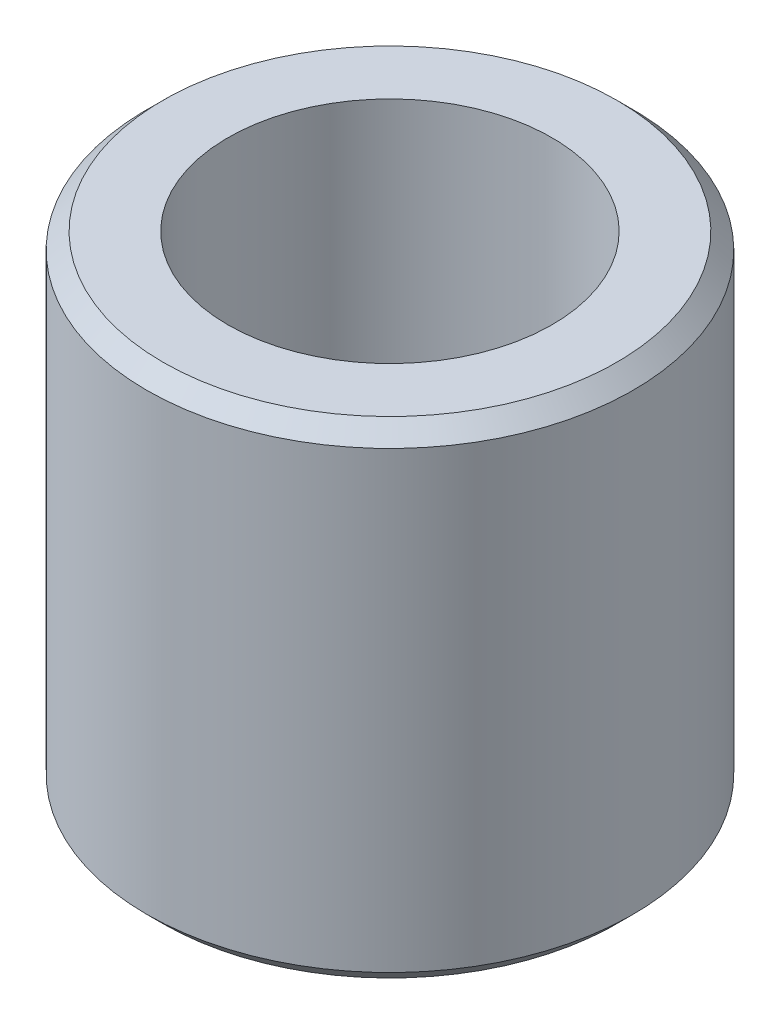
ISO-10303-21;
HEADER;
FILE_DESCRIPTION(('STEP AP214'),'2;1');
FILE_NAME('part.step','',(''),(''),'','','');
FILE_SCHEMA(('AUTOMOTIVE_DESIGN { 1 0 10303 214 1 1 1 1 }'));
ENDSEC;
DATA;
#1=APPLICATION_CONTEXT('core data for automotive mechanical design processes');
#2=APPLICATION_PROTOCOL_DEFINITION('international standard','automotive_design',2000,#1);
#3=PRODUCT_CONTEXT('',#1,'mechanical');
#4=PRODUCT('Part','Part','',(#3));
#5=PRODUCT_RELATED_PRODUCT_CATEGORY('part','',(#4));
#6=PRODUCT_DEFINITION_FORMATION('','',#4);
#7=PRODUCT_DEFINITION_CONTEXT('part definition',#1,'design');
#8=PRODUCT_DEFINITION('design','',#6,#7);
#9=PRODUCT_DEFINITION_SHAPE('','',#8);
#10=(LENGTH_UNIT() NAMED_UNIT(*) SI_UNIT(.MILLI.,.METRE.));
#11=(NAMED_UNIT(*) PLANE_ANGLE_UNIT() SI_UNIT($,.RADIAN.));
#12=(NAMED_UNIT(*) SI_UNIT($,.STERADIAN.) SOLID_ANGLE_UNIT());
#13=UNCERTAINTY_MEASURE_WITH_UNIT(LENGTH_MEASURE(1.E-05),#10,'distance_accuracy_value','');
#14=(GEOMETRIC_REPRESENTATION_CONTEXT(3) GLOBAL_UNCERTAINTY_ASSIGNED_CONTEXT((#13)) GLOBAL_UNIT_ASSIGNED_CONTEXT((#10,
#11,#12)) REPRESENTATION_CONTEXT('',''));
#15=CARTESIAN_POINT('',(0.,0.,0.));
#16=DIRECTION('',(0.,0.,1.));
#17=DIRECTION('',(1.,0.,0.));
#18=AXIS2_PLACEMENT_3D('',#15,#16,#17);
#19=CARTESIAN_POINT('',(0.,30.,0.));
#20=DIRECTION('',(0.,1.,0.));
#21=DIRECTION('',(0.,0.,1.));
#22=AXIS2_PLACEMENT_3D('',#19,#20,#21);
#23=PLANE('',#22);
#24=CARTESIAN_POINT('',(0.,30.,0.));
#25=DIRECTION('',(0.,1.,0.));
#26=DIRECTION('',(0.,0.,1.));
#27=AXIS2_PLACEMENT_3D('',#24,#25,#26);
#28=CIRCLE('',#27,14.);
#29=CARTESIAN_POINT('',(0.,30.,14.));
#30=VERTEX_POINT('',#29);
#31=EDGE_CURVE('E46',#30,#30,#28,.T.);
#32=ORIENTED_EDGE('',*,*,#31,.T.);
#33=EDGE_LOOP('',(#32));
#34=FACE_BOUND('',#33,.T.);
#35=CARTESIAN_POINT('',(0.,30.,0.));
#36=DIRECTION('',(0.,1.,0.));
#37=DIRECTION('',(0.,0.,1.));
#38=AXIS2_PLACEMENT_3D('',#35,#36,#37);
#39=CIRCLE('',#38,10.);
#40=CARTESIAN_POINT('',(0.,30.,10.));
#41=VERTEX_POINT('',#40);
#42=EDGE_CURVE('E59',#41,#41,#39,.T.);
#43=ORIENTED_EDGE('',*,*,#42,.F.);
#44=EDGE_LOOP('',(#43));
#45=FACE_BOUND('',#44,.T.);
#46=ADVANCED_FACE('F38',(#34,#45),#23,.T.);
#47=CARTESIAN_POINT('',(0.,0.,0.));
#48=DIRECTION('',(0.,1.,0.));
#49=DIRECTION('',(0.,0.,1.));
#50=AXIS2_PLACEMENT_3D('',#47,#48,#49);
#51=PLANE('',#50);
#52=CARTESIAN_POINT('',(0.,0.,0.));
#53=DIRECTION('',(0.,1.,0.));
#54=DIRECTION('',(0.,0.,1.));
#55=AXIS2_PLACEMENT_3D('',#52,#53,#54);
#56=CIRCLE('',#55,14.);
#57=CARTESIAN_POINT('',(0.,0.,14.));
#58=VERTEX_POINT('',#57);
#59=EDGE_CURVE('E50',#58,#58,#56,.F.);
#60=ORIENTED_EDGE('',*,*,#59,.T.);
#61=EDGE_LOOP('',(#60));
#62=FACE_BOUND('',#61,.T.);
#63=CARTESIAN_POINT('',(0.,0.,0.));
#64=DIRECTION('',(0.,1.,0.));
#65=DIRECTION('',(0.,0.,1.));
#66=AXIS2_PLACEMENT_3D('',#63,#64,#65);
#67=CIRCLE('',#66,10.);
#68=CARTESIAN_POINT('',(0.,0.,10.));
#69=VERTEX_POINT('',#68);
#70=EDGE_CURVE('E60',#69,#69,#67,.T.);
#71=ORIENTED_EDGE('',*,*,#70,.T.);
#72=EDGE_LOOP('',(#71));
#73=FACE_BOUND('',#72,.T.);
#74=ADVANCED_FACE('F70',(#62,#73),#51,.F.);
#75=CARTESIAN_POINT('',(0.,30.,0.));
#76=DIRECTION('',(0.,-1.,0.));
#77=DIRECTION('',(0.,0.,-1.));
#78=AXIS2_PLACEMENT_3D('',#75,#76,#77);
#79=CYLINDRICAL_SURFACE('',#78,15.);
#80=CARTESIAN_POINT('',(0.,29.,0.));
#81=DIRECTION('',(0.,1.,0.));
#82=DIRECTION('',(0.,0.,1.));
#83=AXIS2_PLACEMENT_3D('',#80,#81,#82);
#84=CIRCLE('',#83,15.);
#85=CARTESIAN_POINT('',(0.,29.,15.));
#86=VERTEX_POINT('',#85);
#87=EDGE_CURVE('E10',#86,#86,#84,.F.);
#88=ORIENTED_EDGE('',*,*,#87,.T.);
#89=EDGE_LOOP('',(#88));
#90=FACE_BOUND('',#89,.T.);
#91=CARTESIAN_POINT('',(0.,1.,0.));
#92=DIRECTION('',(0.,1.,0.));
#93=DIRECTION('',(0.,0.,1.));
#94=AXIS2_PLACEMENT_3D('',#91,#92,#93);
#95=CIRCLE('',#94,15.);
#96=CARTESIAN_POINT('',(0.,1.,15.));
#97=VERTEX_POINT('',#96);
#98=EDGE_CURVE('E54',#97,#97,#95,.T.);
#99=ORIENTED_EDGE('',*,*,#98,.T.);
#100=EDGE_LOOP('',(#99));
#101=FACE_BOUND('',#100,.T.);
#102=ADVANCED_FACE('F75',(#90,#101),#79,.T.);
#103=CARTESIAN_POINT('',(0.,30.,0.));
#104=DIRECTION('',(0.,-1.,0.));
#105=DIRECTION('',(0.,0.,-1.));
#106=AXIS2_PLACEMENT_3D('',#103,#104,#105);
#107=CYLINDRICAL_SURFACE('',#106,10.);
#108=ORIENTED_EDGE('',*,*,#42,.T.);
#109=EDGE_LOOP('',(#108));
#110=FACE_BOUND('',#109,.T.);
#111=ORIENTED_EDGE('',*,*,#70,.F.);
#112=EDGE_LOOP('',(#111));
#113=FACE_BOUND('',#112,.T.);
#114=ADVANCED_FACE('F66',(#110,#113),#107,.F.);
#115=CARTESIAN_POINT('',(0.,1.,0.));
#116=DIRECTION('',(0.,1.,0.));
#117=DIRECTION('',(0.,0.,1.));
#118=AXIS2_PLACEMENT_3D('',#115,#116,#117);
#119=CONICAL_SURFACE('',#118,15.,0.785398163397449);
#120=ORIENTED_EDGE('',*,*,#59,.F.);
#121=EDGE_LOOP('',(#120));
#122=FACE_BOUND('',#121,.T.);
#123=ORIENTED_EDGE('',*,*,#98,.F.);
#124=EDGE_LOOP('',(#123));
#125=FACE_BOUND('',#124,.T.);
#126=ADVANCED_FACE('F82',(#122,#125),#119,.T.);
#127=CARTESIAN_POINT('',(0.,30.,0.));
#128=DIRECTION('',(0.,-1.,0.));
#129=DIRECTION('',(0.,0.,-1.));
#130=AXIS2_PLACEMENT_3D('',#127,#128,#129);
#131=CONICAL_SURFACE('',#130,14.,0.785398163397449);
#132=ORIENTED_EDGE('',*,*,#87,.F.);
#133=EDGE_LOOP('',(#132));
#134=FACE_BOUND('',#133,.T.);
#135=ORIENTED_EDGE('',*,*,#31,.F.);
#136=EDGE_LOOP('',(#135));
#137=FACE_BOUND('',#136,.T.);
#138=ADVANCED_FACE('F41',(#134,#137),#131,.T.);
#139=CLOSED_SHELL('',(#46,#74,#102,#114,#126,#138));
#140=MANIFOLD_SOLID_BREP('B2',#139);
#141=ADVANCED_BREP_SHAPE_REPRESENTATION('',(#18,#140),#14);
#142=SHAPE_DEFINITION_REPRESENTATION(#9,#141);
ENDSEC;
END-ISO-10303-21;
